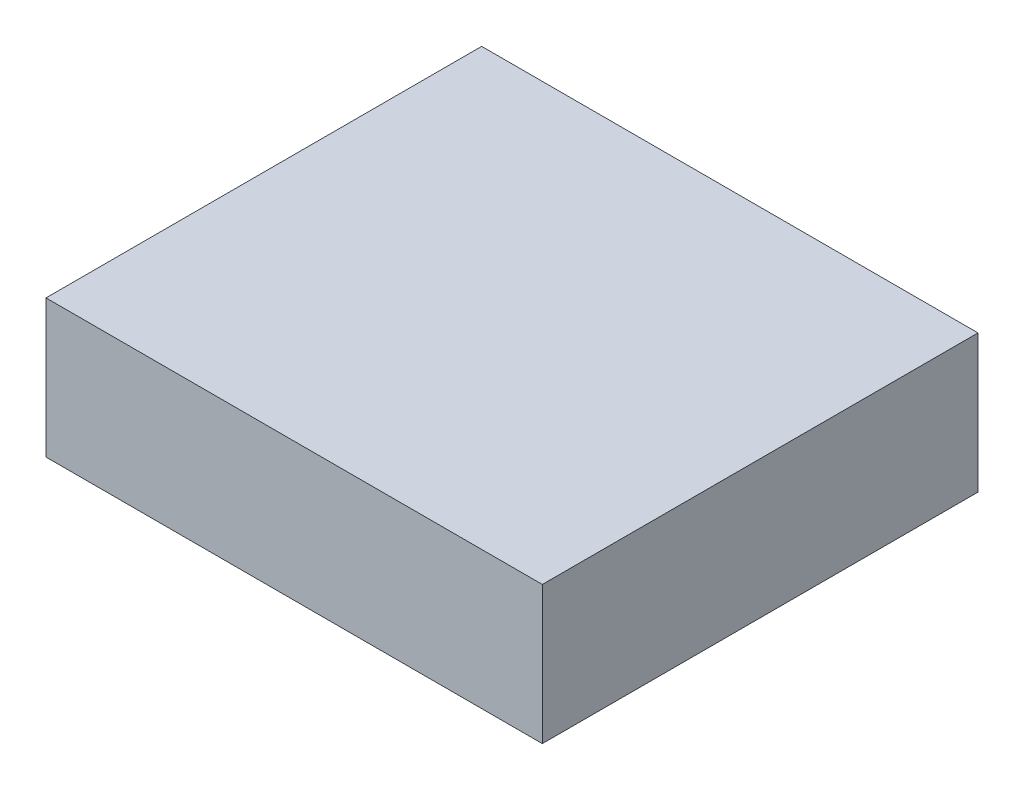
ISO-10303-21;
HEADER;
FILE_DESCRIPTION(('STEP AP214'),'2;1');
FILE_NAME('part.step','',(''),(''),'','','');
FILE_SCHEMA(('AUTOMOTIVE_DESIGN { 1 0 10303 214 1 1 1 1 }'));
ENDSEC;
DATA;
#1=APPLICATION_CONTEXT('core data for automotive mechanical design processes');
#2=APPLICATION_PROTOCOL_DEFINITION('international standard','automotive_design',2000,#1);
#3=PRODUCT_CONTEXT('',#1,'mechanical');
#4=PRODUCT('Part','Part','',(#3));
#5=PRODUCT_RELATED_PRODUCT_CATEGORY('part','',(#4));
#6=PRODUCT_DEFINITION_FORMATION('','',#4);
#7=PRODUCT_DEFINITION_CONTEXT('part definition',#1,'design');
#8=PRODUCT_DEFINITION('design','',#6,#7);
#9=PRODUCT_DEFINITION_SHAPE('','',#8);
#10=(LENGTH_UNIT() NAMED_UNIT(*) SI_UNIT(.MILLI.,.METRE.));
#11=(NAMED_UNIT(*) PLANE_ANGLE_UNIT() SI_UNIT($,.RADIAN.));
#12=(NAMED_UNIT(*) SI_UNIT($,.STERADIAN.) SOLID_ANGLE_UNIT());
#13=UNCERTAINTY_MEASURE_WITH_UNIT(LENGTH_MEASURE(1.E-05),#10,'distance_accuracy_value','');
#14=(GEOMETRIC_REPRESENTATION_CONTEXT(3) GLOBAL_UNCERTAINTY_ASSIGNED_CONTEXT((#13)) GLOBAL_UNIT_ASSIGNED_CONTEXT((#10,
#11,#12)) REPRESENTATION_CONTEXT('',''));
#15=CARTESIAN_POINT('',(0.,0.,0.));
#16=DIRECTION('',(0.,0.,1.));
#17=DIRECTION('',(1.,0.,0.));
#18=AXIS2_PLACEMENT_3D('',#15,#16,#17);
#19=CARTESIAN_POINT('',(-45.,25.,39.5));
#20=DIRECTION('',(1.,0.,0.));
#21=DIRECTION('',(0.,0.,-1.));
#22=AXIS2_PLACEMENT_3D('',#19,#20,#21);
#23=PLANE('',#22);
#24=DIRECTION('',(0.,0.,1.));
#25=VECTOR('',#24,1.);
#26=CARTESIAN_POINT('',(-45.,0.,39.5));
#27=LINE('',#26,#25);
#28=CARTESIAN_POINT('',(-45.,0.,-39.5));
#29=VERTEX_POINT('',#28);
#30=CARTESIAN_POINT('',(-45.,0.,39.5));
#31=VERTEX_POINT('',#30);
#32=EDGE_CURVE('E139',#29,#31,#27,.T.);
#33=ORIENTED_EDGE('',*,*,#32,.T.);
#34=DIRECTION('',(0.,-1.,0.));
#35=VECTOR('',#34,1.);
#36=CARTESIAN_POINT('',(-45.,25.,39.5));
#37=LINE('',#36,#35);
#38=CARTESIAN_POINT('',(-45.,25.,39.5));
#39=VERTEX_POINT('',#38);
#40=EDGE_CURVE('E144',#39,#31,#37,.T.);
#41=ORIENTED_EDGE('',*,*,#40,.F.);
#42=DIRECTION('',(0.,0.,1.));
#43=VECTOR('',#42,1.);
#44=CARTESIAN_POINT('',(-45.,25.,39.5));
#45=LINE('',#44,#43);
#46=CARTESIAN_POINT('',(-45.,25.,-39.5));
#47=VERTEX_POINT('',#46);
#48=EDGE_CURVE('E133',#47,#39,#45,.T.);
#49=ORIENTED_EDGE('',*,*,#48,.F.);
#50=DIRECTION('',(0.,-1.,0.));
#51=VECTOR('',#50,1.);
#52=CARTESIAN_POINT('',(-45.,25.,-39.5));
#53=LINE('',#52,#51);
#54=EDGE_CURVE('E40',#47,#29,#53,.T.);
#55=ORIENTED_EDGE('',*,*,#54,.T.);
#56=EDGE_LOOP('',(#33,#41,#49,#55));
#57=FACE_BOUND('',#56,.T.);
#58=DIRECTION('',(0.,-1.,0.));
#59=VECTOR('',#58,1.);
#60=CARTESIAN_POINT('',(-45.,19.1378860220475,-31.3291308429104));
#61=LINE('',#60,#59);
#62=CARTESIAN_POINT('',(-45.,19.1378860220475,-31.3291308429104));
#63=VERTEX_POINT('',#62);
#64=CARTESIAN_POINT('',(-45.,7.63785418767279,-31.3291308429104));
#65=VERTEX_POINT('',#64);
#66=EDGE_CURVE('E117',#63,#65,#61,.T.);
#67=ORIENTED_EDGE('',*,*,#66,.F.);
#68=DIRECTION('',(0.,0.,-1.));
#69=VECTOR('',#68,1.);
#70=CARTESIAN_POINT('',(-45.,19.1378860220475,-31.3291308429104));
#71=LINE('',#70,#69);
#72=CARTESIAN_POINT('',(-45.,19.1378860220475,-16.1085004738851));
#73=VERTEX_POINT('',#72);
#74=EDGE_CURVE('E114',#73,#63,#71,.T.);
#75=ORIENTED_EDGE('',*,*,#74,.F.);
#76=DIRECTION('',(0.,1.,0.));
#77=VECTOR('',#76,1.);
#78=CARTESIAN_POINT('',(-45.,19.1378860220475,-16.1085004738851));
#79=LINE('',#78,#77);
#80=CARTESIAN_POINT('',(-45.,7.63785418767279,-16.1085004738851));
#81=VERTEX_POINT('',#80);
#82=EDGE_CURVE('E52',#81,#73,#79,.T.);
#83=ORIENTED_EDGE('',*,*,#82,.F.);
#84=DIRECTION('',(0.,0.,1.));
#85=VECTOR('',#84,1.);
#86=CARTESIAN_POINT('',(-45.,7.63785418767279,-31.3291308429104));
#87=LINE('',#86,#85);
#88=EDGE_CURVE('E47',#65,#81,#87,.T.);
#89=ORIENTED_EDGE('',*,*,#88,.F.);
#90=EDGE_LOOP('',(#67,#75,#83,#89));
#91=FACE_BOUND('',#90,.T.);
#92=ADVANCED_FACE('F32',(#57,#91),#23,.F.);
#93=CARTESIAN_POINT('',(45.,25.,39.5));
#94=DIRECTION('',(-1.,0.,0.));
#95=DIRECTION('',(0.,0.,1.));
#96=AXIS2_PLACEMENT_3D('',#93,#94,#95);
#97=PLANE('',#96);
#98=DIRECTION('',(0.,0.,-1.));
#99=VECTOR('',#98,1.);
#100=CARTESIAN_POINT('',(45.,0.,39.5));
#101=LINE('',#100,#99);
#102=CARTESIAN_POINT('',(45.,0.,39.5));
#103=VERTEX_POINT('',#102);
#104=CARTESIAN_POINT('',(45.,0.,-39.5));
#105=VERTEX_POINT('',#104);
#106=EDGE_CURVE('E118',#103,#105,#101,.T.);
#107=ORIENTED_EDGE('',*,*,#106,.T.);
#108=DIRECTION('',(0.,-1.,0.));
#109=VECTOR('',#108,1.);
#110=CARTESIAN_POINT('',(45.,25.,-39.5));
#111=LINE('',#110,#109);
#112=CARTESIAN_POINT('',(45.,25.,-39.5));
#113=VERTEX_POINT('',#112);
#114=EDGE_CURVE('E11',#113,#105,#111,.T.);
#115=ORIENTED_EDGE('',*,*,#114,.F.);
#116=DIRECTION('',(0.,0.,-1.));
#117=VECTOR('',#116,1.);
#118=CARTESIAN_POINT('',(45.,25.,39.5));
#119=LINE('',#118,#117);
#120=CARTESIAN_POINT('',(45.,25.,39.5));
#121=VERTEX_POINT('',#120);
#122=EDGE_CURVE('E127',#121,#113,#119,.T.);
#123=ORIENTED_EDGE('',*,*,#122,.F.);
#124=DIRECTION('',(0.,-1.,0.));
#125=VECTOR('',#124,1.);
#126=CARTESIAN_POINT('',(45.,25.,39.5));
#127=LINE('',#126,#125);
#128=EDGE_CURVE('E136',#121,#103,#127,.T.);
#129=ORIENTED_EDGE('',*,*,#128,.T.);
#130=EDGE_LOOP('',(#107,#115,#123,#129));
#131=FACE_BOUND('',#130,.T.);
#132=ADVANCED_FACE('F34',(#131),#97,.F.);
#133=CARTESIAN_POINT('',(-45.,25.,-39.5));
#134=DIRECTION('',(0.,0.,1.));
#135=DIRECTION('',(1.,0.,0.));
#136=AXIS2_PLACEMENT_3D('',#133,#134,#135);
#137=PLANE('',#136);
#138=DIRECTION('',(-1.,0.,0.));
#139=VECTOR('',#138,1.);
#140=CARTESIAN_POINT('',(-45.,0.,-39.5));
#141=LINE('',#140,#139);
#142=EDGE_CURVE('E121',#105,#29,#141,.T.);
#143=ORIENTED_EDGE('',*,*,#142,.T.);
#144=ORIENTED_EDGE('',*,*,#54,.F.);
#145=DIRECTION('',(-1.,0.,0.));
#146=VECTOR('',#145,1.);
#147=CARTESIAN_POINT('',(-45.,25.,-39.5));
#148=LINE('',#147,#146);
#149=EDGE_CURVE('E130',#113,#47,#148,.T.);
#150=ORIENTED_EDGE('',*,*,#149,.F.);
#151=ORIENTED_EDGE('',*,*,#114,.T.);
#152=EDGE_LOOP('',(#143,#144,#150,#151));
#153=FACE_BOUND('',#152,.T.);
#154=ADVANCED_FACE('F166',(#153),#137,.F.);
#155=CARTESIAN_POINT('',(-45.,25.,39.5));
#156=DIRECTION('',(0.,0.,-1.));
#157=DIRECTION('',(-1.,0.,0.));
#158=AXIS2_PLACEMENT_3D('',#155,#156,#157);
#159=PLANE('',#158);
#160=DIRECTION('',(1.,0.,0.));
#161=VECTOR('',#160,1.);
#162=CARTESIAN_POINT('',(-45.,0.,39.5));
#163=LINE('',#162,#161);
#164=EDGE_CURVE('E131',#31,#103,#163,.T.);
#165=ORIENTED_EDGE('',*,*,#164,.T.);
#166=ORIENTED_EDGE('',*,*,#128,.F.);
#167=DIRECTION('',(1.,0.,0.));
#168=VECTOR('',#167,1.);
#169=CARTESIAN_POINT('',(-45.,25.,39.5));
#170=LINE('',#169,#168);
#171=EDGE_CURVE('E135',#39,#121,#170,.T.);
#172=ORIENTED_EDGE('',*,*,#171,.F.);
#173=ORIENTED_EDGE('',*,*,#40,.T.);
#174=EDGE_LOOP('',(#165,#166,#172,#173));
#175=FACE_BOUND('',#174,.T.);
#176=ADVANCED_FACE('F159',(#175),#159,.F.);
#177=CARTESIAN_POINT('',(0.,25.,0.));
#178=DIRECTION('',(0.,-1.,0.));
#179=DIRECTION('',(0.,0.,-1.));
#180=AXIS2_PLACEMENT_3D('',#177,#178,#179);
#181=PLANE('',#180);
#182=ORIENTED_EDGE('',*,*,#122,.T.);
#183=ORIENTED_EDGE('',*,*,#149,.T.);
#184=ORIENTED_EDGE('',*,*,#48,.T.);
#185=ORIENTED_EDGE('',*,*,#171,.T.);
#186=EDGE_LOOP('',(#182,#183,#184,#185));
#187=FACE_BOUND('',#186,.T.);
#188=ADVANCED_FACE('F165',(#187),#181,.F.);
#189=CARTESIAN_POINT('',(0.,0.,0.));
#190=DIRECTION('',(0.,-1.,0.));
#191=DIRECTION('',(0.,0.,-1.));
#192=AXIS2_PLACEMENT_3D('',#189,#190,#191);
#193=PLANE('',#192);
#194=ORIENTED_EDGE('',*,*,#106,.F.);
#195=ORIENTED_EDGE('',*,*,#164,.F.);
#196=ORIENTED_EDGE('',*,*,#32,.F.);
#197=ORIENTED_EDGE('',*,*,#142,.F.);
#198=EDGE_LOOP('',(#194,#195,#196,#197));
#199=FACE_BOUND('',#198,.T.);
#200=ADVANCED_FACE('F156',(#199),#193,.T.);
#201=CARTESIAN_POINT('',(-49.5,19.1378860220475,-31.3291308429104));
#202=DIRECTION('',(0.,0.,1.));
#203=DIRECTION('',(1.,0.,0.));
#204=AXIS2_PLACEMENT_3D('',#201,#202,#203);
#205=PLANE('',#204);
#206=ORIENTED_EDGE('',*,*,#66,.T.);
#207=DIRECTION('',(1.,0.,0.));
#208=VECTOR('',#207,1.);
#209=CARTESIAN_POINT('',(-49.5,7.63785418767279,-31.3291308429104));
#210=LINE('',#209,#208);
#211=CARTESIAN_POINT('',(-49.5,7.63785418767279,-31.3291308429104));
#212=VERTEX_POINT('',#211);
#213=EDGE_CURVE('E98',#212,#65,#210,.T.);
#214=ORIENTED_EDGE('',*,*,#213,.F.);
#215=DIRECTION('',(0.,-1.,0.));
#216=VECTOR('',#215,1.);
#217=CARTESIAN_POINT('',(-49.5,19.1378860220475,-31.3291308429104));
#218=LINE('',#217,#216);
#219=CARTESIAN_POINT('',(-49.5,19.1378860220475,-31.3291308429104));
#220=VERTEX_POINT('',#219);
#221=EDGE_CURVE('E105',#220,#212,#218,.T.);
#222=ORIENTED_EDGE('',*,*,#221,.F.);
#223=DIRECTION('',(1.,0.,0.));
#224=VECTOR('',#223,1.);
#225=CARTESIAN_POINT('',(-49.5,19.1378860220475,-31.3291308429104));
#226=LINE('',#225,#224);
#227=EDGE_CURVE('E259',#220,#63,#226,.T.);
#228=ORIENTED_EDGE('',*,*,#227,.T.);
#229=EDGE_LOOP('',(#206,#214,#222,#228));
#230=FACE_BOUND('',#229,.T.);
#231=ADVANCED_FACE('F116',(#230),#205,.F.);
#232=CARTESIAN_POINT('',(-49.5,7.63785418767279,-31.3291308429104));
#233=DIRECTION('',(0.,1.,0.));
#234=DIRECTION('',(0.,0.,1.));
#235=AXIS2_PLACEMENT_3D('',#232,#233,#234);
#236=PLANE('',#235);
#237=ORIENTED_EDGE('',*,*,#88,.T.);
#238=DIRECTION('',(1.,0.,0.));
#239=VECTOR('',#238,1.);
#240=CARTESIAN_POINT('',(-49.5,7.63785418767279,-16.1085004738851));
#241=LINE('',#240,#239);
#242=CARTESIAN_POINT('',(-49.5,7.63785418767279,-16.1085004738851));
#243=VERTEX_POINT('',#242);
#244=EDGE_CURVE('E101',#243,#81,#241,.T.);
#245=ORIENTED_EDGE('',*,*,#244,.F.);
#246=DIRECTION('',(0.,0.,1.));
#247=VECTOR('',#246,1.);
#248=CARTESIAN_POINT('',(-49.5,7.63785418767279,-31.3291308429104));
#249=LINE('',#248,#247);
#250=EDGE_CURVE('E94',#212,#243,#249,.T.);
#251=ORIENTED_EDGE('',*,*,#250,.F.);
#252=ORIENTED_EDGE('',*,*,#213,.T.);
#253=EDGE_LOOP('',(#237,#245,#251,#252));
#254=FACE_BOUND('',#253,.T.);
#255=ADVANCED_FACE('F96',(#254),#236,.F.);
#256=CARTESIAN_POINT('',(-49.5,19.1378860220475,-16.1085004738851));
#257=DIRECTION('',(0.,0.,-1.));
#258=DIRECTION('',(-1.,0.,0.));
#259=AXIS2_PLACEMENT_3D('',#256,#257,#258);
#260=PLANE('',#259);
#261=ORIENTED_EDGE('',*,*,#82,.T.);
#262=DIRECTION('',(1.,0.,0.));
#263=VECTOR('',#262,1.);
#264=CARTESIAN_POINT('',(-49.5,19.1378860220475,-16.1085004738851));
#265=LINE('',#264,#263);
#266=CARTESIAN_POINT('',(-49.5,19.1378860220475,-16.1085004738851));
#267=VERTEX_POINT('',#266);
#268=EDGE_CURVE('E123',#267,#73,#265,.T.);
#269=ORIENTED_EDGE('',*,*,#268,.F.);
#270=DIRECTION('',(0.,1.,0.));
#271=VECTOR('',#270,1.);
#272=CARTESIAN_POINT('',(-49.5,19.1378860220475,-16.1085004738851));
#273=LINE('',#272,#271);
#274=EDGE_CURVE('E104',#243,#267,#273,.T.);
#275=ORIENTED_EDGE('',*,*,#274,.F.);
#276=ORIENTED_EDGE('',*,*,#244,.T.);
#277=EDGE_LOOP('',(#261,#269,#275,#276));
#278=FACE_BOUND('',#277,.T.);
#279=ADVANCED_FACE('F186',(#278),#260,.F.);
#280=CARTESIAN_POINT('',(-49.5,19.1378860220475,-31.3291308429104));
#281=DIRECTION('',(0.,-1.,0.));
#282=DIRECTION('',(0.,0.,-1.));
#283=AXIS2_PLACEMENT_3D('',#280,#281,#282);
#284=PLANE('',#283);
#285=ORIENTED_EDGE('',*,*,#74,.T.);
#286=ORIENTED_EDGE('',*,*,#227,.F.);
#287=DIRECTION('',(0.,0.,-1.));
#288=VECTOR('',#287,1.);
#289=CARTESIAN_POINT('',(-49.5,19.1378860220475,-31.3291308429104));
#290=LINE('',#289,#288);
#291=EDGE_CURVE('E110',#267,#220,#290,.T.);
#292=ORIENTED_EDGE('',*,*,#291,.F.);
#293=ORIENTED_EDGE('',*,*,#268,.T.);
#294=EDGE_LOOP('',(#285,#286,#292,#293));
#295=FACE_BOUND('',#294,.T.);
#296=ADVANCED_FACE('F189',(#295),#284,.F.);
#297=CARTESIAN_POINT('',(-49.5,0.,0.));
#298=DIRECTION('',(-1.,0.,0.));
#299=DIRECTION('',(0.,0.,1.));
#300=AXIS2_PLACEMENT_3D('',#297,#298,#299);
#301=PLANE('',#300);
#302=ORIENTED_EDGE('',*,*,#221,.T.);
#303=ORIENTED_EDGE('',*,*,#250,.T.);
#304=ORIENTED_EDGE('',*,*,#274,.T.);
#305=ORIENTED_EDGE('',*,*,#291,.T.);
#306=EDGE_LOOP('',(#302,#303,#304,#305));
#307=FACE_BOUND('',#306,.T.);
#308=ADVANCED_FACE('F108',(#307),#301,.T.);
#309=CLOSED_SHELL('',(#92,#132,#154,#176,#188,#200,#231,#255,#279,#296,#308));
#310=MANIFOLD_SOLID_BREP('B2',#309);
#311=ADVANCED_BREP_SHAPE_REPRESENTATION('',(#18,#310),#14);
#312=SHAPE_DEFINITION_REPRESENTATION(#9,#311);
ENDSEC;
END-ISO-10303-21;
